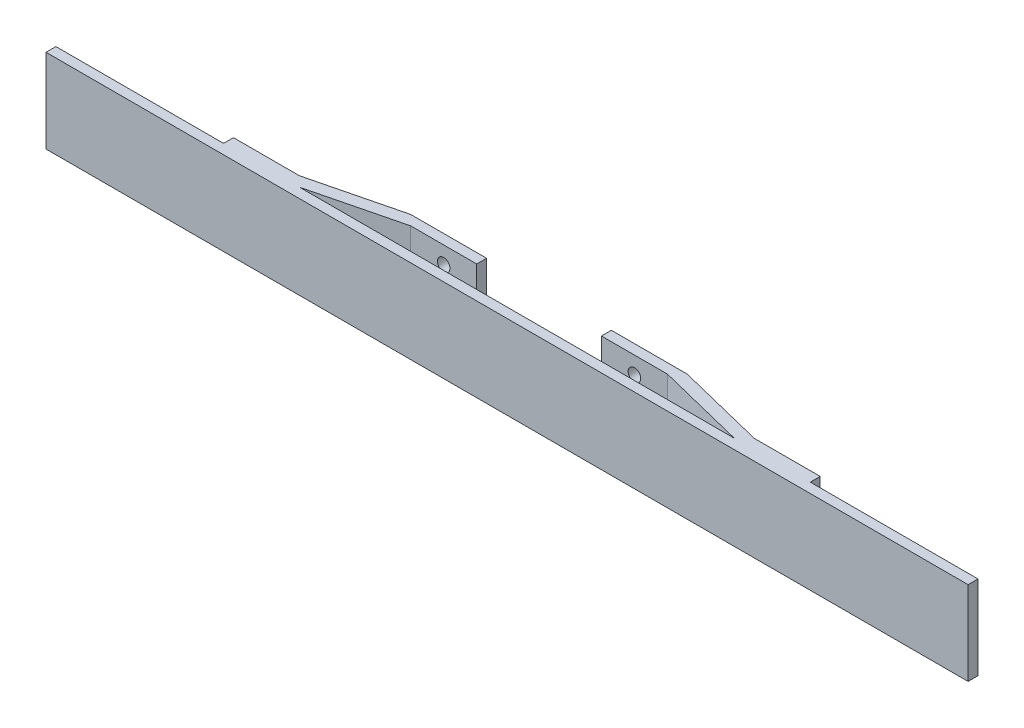
ISO-10303-21;
HEADER;
FILE_DESCRIPTION(('STEP AP214'),'2;1');
FILE_NAME('part.step','',(''),(''),'','','');
FILE_SCHEMA(('AUTOMOTIVE_DESIGN { 1 0 10303 214 1 1 1 1 }'));
ENDSEC;
DATA;
#1=APPLICATION_CONTEXT('core data for automotive mechanical design processes');
#2=APPLICATION_PROTOCOL_DEFINITION('international standard','automotive_design',2000,#1);
#3=PRODUCT_CONTEXT('',#1,'mechanical');
#4=PRODUCT('Part','Part','',(#3));
#5=PRODUCT_RELATED_PRODUCT_CATEGORY('part','',(#4));
#6=PRODUCT_DEFINITION_FORMATION('','',#4);
#7=PRODUCT_DEFINITION_CONTEXT('part definition',#1,'design');
#8=PRODUCT_DEFINITION('design','',#6,#7);
#9=PRODUCT_DEFINITION_SHAPE('','',#8);
#10=(LENGTH_UNIT() NAMED_UNIT(*) SI_UNIT(.MILLI.,.METRE.));
#11=(NAMED_UNIT(*) PLANE_ANGLE_UNIT() SI_UNIT($,.RADIAN.));
#12=(NAMED_UNIT(*) SI_UNIT($,.STERADIAN.) SOLID_ANGLE_UNIT());
#13=UNCERTAINTY_MEASURE_WITH_UNIT(LENGTH_MEASURE(1.E-05),#10,'distance_accuracy_value','');
#14=(GEOMETRIC_REPRESENTATION_CONTEXT(3) GLOBAL_UNCERTAINTY_ASSIGNED_CONTEXT((#13)) GLOBAL_UNIT_ASSIGNED_CONTEXT((#10,
#11,#12)) REPRESENTATION_CONTEXT('',''));
#15=CARTESIAN_POINT('',(0.,0.,0.));
#16=DIRECTION('',(0.,0.,1.));
#17=DIRECTION('',(1.,0.,0.));
#18=AXIS2_PLACEMENT_3D('',#15,#16,#17);
#19=CARTESIAN_POINT('',(-13.3330218068536,-14.8364485981308,9.7));
#20=DIRECTION('',(0.,0.,1.));
#21=DIRECTION('',(1.,0.,0.));
#22=AXIS2_PLACEMENT_3D('',#19,#20,#21);
#23=PLANE('',#22);
#24=DIRECTION('',(0.,1.,0.));
#25=VECTOR('',#24,1.);
#26=CARTESIAN_POINT('',(37.4669781931464,10.5635514018692,9.7));
#27=LINE('',#26,#25);
#28=CARTESIAN_POINT('',(37.4669781931464,-14.8364485981308,9.7));
#29=VERTEX_POINT('',#28);
#30=CARTESIAN_POINT('',(37.4669781931464,10.5635514018692,9.7));
#31=VERTEX_POINT('',#30);
#32=EDGE_CURVE('E239',#29,#31,#27,.T.);
#33=ORIENTED_EDGE('',*,*,#32,.F.);
#34=DIRECTION('',(1.,0.,0.));
#35=VECTOR('',#34,1.);
#36=CARTESIAN_POINT('',(-13.3330218068536,-14.8364485981308,9.7));
#37=LINE('',#36,#35);
#38=CARTESIAN_POINT('',(-13.3330218068536,-14.8364485981308,9.7));
#39=VERTEX_POINT('',#38);
#40=EDGE_CURVE('E198',#39,#29,#37,.T.);
#41=ORIENTED_EDGE('',*,*,#40,.F.);
#42=DIRECTION('',(0.,1.,0.));
#43=VECTOR('',#42,1.);
#44=CARTESIAN_POINT('',(-13.3330218068536,-14.8364485981308,9.7));
#45=LINE('',#44,#43);
#46=CARTESIAN_POINT('',(-13.3330218068536,10.5635514018692,9.7));
#47=VERTEX_POINT('',#46);
#48=EDGE_CURVE('E196',#39,#47,#45,.T.);
#49=ORIENTED_EDGE('',*,*,#48,.T.);
#50=DIRECTION('',(1.,0.,0.));
#51=VECTOR('',#50,1.);
#52=CARTESIAN_POINT('',(-13.3330218068536,10.5635514018692,9.7));
#53=LINE('',#52,#51);
#54=EDGE_CURVE('E186',#47,#31,#53,.T.);
#55=ORIENTED_EDGE('',*,*,#54,.T.);
#56=EDGE_LOOP('',(#33,#41,#49,#55));
#57=FACE_BOUND('',#56,.T.);
#58=ADVANCED_FACE('F34',(#57),#23,.F.);
#59=CARTESIAN_POINT('',(60.4669781931464,-14.8364485981308,9.7));
#60=VERTEX_POINT('',#59);
#61=CARTESIAN_POINT('',(192.266978193146,-14.8364485981308,9.7));
#62=VERTEX_POINT('',#61);
#63=EDGE_CURVE('E206',#60,#62,#37,.T.);
#64=ORIENTED_EDGE('',*,*,#63,.F.);
#65=DIRECTION('',(0.,1.,0.));
#66=VECTOR('',#65,1.);
#67=CARTESIAN_POINT('',(60.4669781931464,-14.8364485981308,9.7));
#68=LINE('',#67,#66);
#69=CARTESIAN_POINT('',(60.4669781931464,10.5635514018692,9.7));
#70=VERTEX_POINT('',#69);
#71=EDGE_CURVE('E281',#60,#70,#68,.T.);
#72=ORIENTED_EDGE('',*,*,#71,.T.);
#73=CARTESIAN_POINT('',(192.266978193146,10.5635514018692,9.7));
#74=VERTEX_POINT('',#73);
#75=EDGE_CURVE('E202',#70,#74,#53,.T.);
#76=ORIENTED_EDGE('',*,*,#75,.T.);
#77=DIRECTION('',(0.,1.,0.));
#78=VECTOR('',#77,1.);
#79=CARTESIAN_POINT('',(192.266978193146,-14.8364485981308,9.7));
#80=LINE('',#79,#78);
#81=EDGE_CURVE('E249',#62,#74,#80,.T.);
#82=ORIENTED_EDGE('',*,*,#81,.F.);
#83=EDGE_LOOP('',(#64,#72,#76,#82));
#84=FACE_BOUND('',#83,.T.);
#85=ADVANCED_FACE('F398',(#84),#23,.F.);
#86=DIRECTION('',(0.,-1.,0.));
#87=VECTOR('',#86,1.);
#88=CARTESIAN_POINT('',(215.266978193146,10.5635514018692,9.7));
#89=LINE('',#88,#87);
#90=CARTESIAN_POINT('',(215.266978193146,10.5635514018692,9.7));
#91=VERTEX_POINT('',#90);
#92=CARTESIAN_POINT('',(215.266978193146,-14.8364485981308,9.7));
#93=VERTEX_POINT('',#92);
#94=EDGE_CURVE('E218',#91,#93,#89,.T.);
#95=ORIENTED_EDGE('',*,*,#94,.F.);
#96=CARTESIAN_POINT('',(266.066978193146,10.5635514018692,9.69999999999999));
#97=VERTEX_POINT('',#96);
#98=EDGE_CURVE('E203',#91,#97,#53,.T.);
#99=ORIENTED_EDGE('',*,*,#98,.T.);
#100=DIRECTION('',(0.,1.,0.));
#101=VECTOR('',#100,1.);
#102=CARTESIAN_POINT('',(266.066978193146,-14.8364485981308,9.69999999999999));
#103=LINE('',#102,#101);
#104=CARTESIAN_POINT('',(266.066978193146,-14.8364485981308,9.69999999999999));
#105=VERTEX_POINT('',#104);
#106=EDGE_CURVE('E193',#105,#97,#103,.T.);
#107=ORIENTED_EDGE('',*,*,#106,.F.);
#108=EDGE_CURVE('E201',#93,#105,#37,.T.);
#109=ORIENTED_EDGE('',*,*,#108,.F.);
#110=EDGE_LOOP('',(#95,#99,#107,#109));
#111=FACE_BOUND('',#110,.T.);
#112=ADVANCED_FACE('F395',(#111),#23,.F.);
#113=CARTESIAN_POINT('',(-26.0330218068536,-14.8364485981308,12.7));
#114=DIRECTION('',(0.,1.,0.));
#115=DIRECTION('',(-1.,0.,0.));
#116=AXIS2_PLACEMENT_3D('',#113,#114,#115);
#117=PLANE('',#116);
#118=DIRECTION('',(1.,0.,0.));
#119=VECTOR('',#118,1.);
#120=CARTESIAN_POINT('',(-26.0330218068536,-14.8364485981308,12.7));
#121=LINE('',#120,#119);
#122=CARTESIAN_POINT('',(-13.3330218068536,-14.8364485981308,12.7));
#123=VERTEX_POINT('',#122);
#124=CARTESIAN_POINT('',(266.066978193146,-14.8364485981308,12.7));
#125=VERTEX_POINT('',#124);
#126=EDGE_CURVE('E191',#123,#125,#121,.T.);
#127=ORIENTED_EDGE('',*,*,#126,.F.);
#128=DIRECTION('',(0.,0.,1.));
#129=VECTOR('',#128,1.);
#130=CARTESIAN_POINT('',(-13.3330218068536,-14.8364485981308,0.));
#131=LINE('',#130,#129);
#132=EDGE_CURVE('E174',#39,#123,#131,.T.);
#133=ORIENTED_EDGE('',*,*,#132,.F.);
#134=ORIENTED_EDGE('',*,*,#40,.T.);
#135=DIRECTION('',(0.,0.,1.));
#136=VECTOR('',#135,1.);
#137=CARTESIAN_POINT('',(37.4669781931464,-14.8364485981308,0.));
#138=LINE('',#137,#136);
#139=CARTESIAN_POINT('',(37.4669781931464,-14.8364485981308,6.7));
#140=VERTEX_POINT('',#139);
#141=EDGE_CURVE('E236',#140,#29,#138,.T.);
#142=ORIENTED_EDGE('',*,*,#141,.F.);
#143=DIRECTION('',(1.,0.,0.));
#144=VECTOR('',#143,1.);
#145=CARTESIAN_POINT('',(37.4669781931464,-14.8364485981308,6.7));
#146=LINE('',#145,#144);
#147=CARTESIAN_POINT('',(57.4669781931464,-14.8364485981308,6.7));
#148=VERTEX_POINT('',#147);
#149=EDGE_CURVE('E310',#140,#148,#146,.T.);
#150=ORIENTED_EDGE('',*,*,#149,.T.);
#151=DIRECTION('',(0.970563929002576,0.,-0.24084364164138));
#152=VECTOR('',#151,1.);
#153=CARTESIAN_POINT('',(57.4669781931464,-14.8364485981308,6.7));
#154=LINE('',#153,#152);
#155=CARTESIAN_POINT('',(84.4669781931464,-14.8364485981308,0.));
#156=VERTEX_POINT('',#155);
#157=EDGE_CURVE('E306',#148,#156,#154,.T.);
#158=ORIENTED_EDGE('',*,*,#157,.T.);
#159=DIRECTION('',(-1.,0.,0.));
#160=VECTOR('',#159,1.);
#161=CARTESIAN_POINT('',(37.4669781931464,-14.8364485981308,0.));
#162=LINE('',#161,#160);
#163=CARTESIAN_POINT('',(107.466978193146,-14.8364485981308,0.));
#164=VERTEX_POINT('',#163);
#165=EDGE_CURVE('E238',#164,#156,#162,.T.);
#166=ORIENTED_EDGE('',*,*,#165,.F.);
#167=DIRECTION('',(0.,0.,1.));
#168=VECTOR('',#167,1.);
#169=CARTESIAN_POINT('',(107.466978193146,-14.8364485981308,0.));
#170=LINE('',#169,#168);
#171=CARTESIAN_POINT('',(107.466978193146,-14.8364485981308,3.));
#172=VERTEX_POINT('',#171);
#173=EDGE_CURVE('E233',#164,#172,#170,.T.);
#174=ORIENTED_EDGE('',*,*,#173,.T.);
#175=DIRECTION('',(-1.,0.,0.));
#176=VECTOR('',#175,1.);
#177=CARTESIAN_POINT('',(107.466978193146,-14.8364485981308,3.));
#178=LINE('',#177,#176);
#179=CARTESIAN_POINT('',(87.4669781931464,-14.8364485981308,3.));
#180=VERTEX_POINT('',#179);
#181=EDGE_CURVE('E49',#172,#180,#178,.T.);
#182=ORIENTED_EDGE('',*,*,#181,.T.);
#183=DIRECTION('',(-0.970563929002577,0.,0.24084364164138));
#184=VECTOR('',#183,1.);
#185=CARTESIAN_POINT('',(87.4669781931464,-14.8364485981308,3.));
#186=LINE('',#185,#184);
#187=EDGE_CURVE('E289',#180,#60,#186,.T.);
#188=ORIENTED_EDGE('',*,*,#187,.T.);
#189=ORIENTED_EDGE('',*,*,#63,.T.);
#190=DIRECTION('',(-0.970563929002576,0.,-0.24084364164138));
#191=VECTOR('',#190,1.);
#192=CARTESIAN_POINT('',(192.266978193146,-14.8364485981308,9.7));
#193=LINE('',#192,#191);
#194=CARTESIAN_POINT('',(165.266978193146,-14.8364485981308,3.));
#195=VERTEX_POINT('',#194);
#196=EDGE_CURVE('E259',#62,#195,#193,.T.);
#197=ORIENTED_EDGE('',*,*,#196,.T.);
#198=DIRECTION('',(-1.,0.,0.));
#199=VECTOR('',#198,1.);
#200=CARTESIAN_POINT('',(165.266978193146,-14.8364485981308,3.));
#201=LINE('',#200,#199);
#202=CARTESIAN_POINT('',(145.266978193146,-14.8364485981308,3.));
#203=VERTEX_POINT('',#202);
#204=EDGE_CURVE('E253',#195,#203,#201,.T.);
#205=ORIENTED_EDGE('',*,*,#204,.T.);
#206=DIRECTION('',(0.,0.,1.));
#207=VECTOR('',#206,1.);
#208=CARTESIAN_POINT('',(145.266978193146,-14.8364485981308,0.));
#209=LINE('',#208,#207);
#210=CARTESIAN_POINT('',(145.266978193146,-14.8364485981308,0.));
#211=VERTEX_POINT('',#210);
#212=EDGE_CURVE('E214',#211,#203,#209,.T.);
#213=ORIENTED_EDGE('',*,*,#212,.F.);
#214=DIRECTION('',(-1.,0.,0.));
#215=VECTOR('',#214,1.);
#216=CARTESIAN_POINT('',(145.266978193146,-14.8364485981308,0.));
#217=LINE('',#216,#215);
#218=CARTESIAN_POINT('',(168.266978193146,-14.8364485981308,0.));
#219=VERTEX_POINT('',#218);
#220=EDGE_CURVE('E217',#219,#211,#217,.T.);
#221=ORIENTED_EDGE('',*,*,#220,.F.);
#222=DIRECTION('',(0.970563929002576,0.,0.24084364164138));
#223=VECTOR('',#222,1.);
#224=CARTESIAN_POINT('',(195.266978193146,-14.8364485981308,6.7));
#225=LINE('',#224,#223);
#226=CARTESIAN_POINT('',(195.266978193146,-14.8364485981308,6.7));
#227=VERTEX_POINT('',#226);
#228=EDGE_CURVE('E277',#219,#227,#225,.T.);
#229=ORIENTED_EDGE('',*,*,#228,.T.);
#230=DIRECTION('',(1.,0.,0.));
#231=VECTOR('',#230,1.);
#232=CARTESIAN_POINT('',(215.266978193146,-14.8364485981308,6.69999999999999));
#233=LINE('',#232,#231);
#234=CARTESIAN_POINT('',(215.266978193146,-14.8364485981308,6.69999999999999));
#235=VERTEX_POINT('',#234);
#236=EDGE_CURVE('E271',#227,#235,#233,.T.);
#237=ORIENTED_EDGE('',*,*,#236,.T.);
#238=DIRECTION('',(0.,0.,1.));
#239=VECTOR('',#238,1.);
#240=CARTESIAN_POINT('',(215.266978193146,-14.8364485981308,0.));
#241=LINE('',#240,#239);
#242=EDGE_CURVE('E212',#235,#93,#241,.T.);
#243=ORIENTED_EDGE('',*,*,#242,.T.);
#244=ORIENTED_EDGE('',*,*,#108,.T.);
#245=DIRECTION('',(0.,0.,1.));
#246=VECTOR('',#245,1.);
#247=CARTESIAN_POINT('',(266.066978193146,-14.8364485981308,0.));
#248=LINE('',#247,#246);
#249=EDGE_CURVE('E318',#105,#125,#248,.T.);
#250=ORIENTED_EDGE('',*,*,#249,.T.);
#251=EDGE_LOOP('',(#127,#133,#134,#142,#150,#158,#166,#174,#182,#188,#189,#197,#205,#213,#221,
#229,#237,#243,#244,#250));
#252=FACE_BOUND('',#251,.T.);
#253=ADVANCED_FACE('F36',(#252),#117,.F.);
#254=CARTESIAN_POINT('',(-26.0330218068536,10.5635514018692,12.7));
#255=DIRECTION('',(0.,1.,0.));
#256=DIRECTION('',(0.,0.,1.));
#257=AXIS2_PLACEMENT_3D('',#254,#255,#256);
#258=PLANE('',#257);
#259=DIRECTION('',(0.,0.,1.));
#260=VECTOR('',#259,1.);
#261=CARTESIAN_POINT('',(-13.3330218068536,10.5635514018692,0.));
#262=LINE('',#261,#260);
#263=CARTESIAN_POINT('',(-13.3330218068536,10.5635514018692,12.7));
#264=VERTEX_POINT('',#263);
#265=EDGE_CURVE('E171',#47,#264,#262,.T.);
#266=ORIENTED_EDGE('',*,*,#265,.T.);
#267=DIRECTION('',(1.,0.,0.));
#268=VECTOR('',#267,1.);
#269=CARTESIAN_POINT('',(-26.0330218068536,10.5635514018692,12.7));
#270=LINE('',#269,#268);
#271=CARTESIAN_POINT('',(266.066978193146,10.5635514018692,12.7));
#272=VERTEX_POINT('',#271);
#273=EDGE_CURVE('E184',#264,#272,#270,.T.);
#274=ORIENTED_EDGE('',*,*,#273,.T.);
#275=DIRECTION('',(0.,0.,1.));
#276=VECTOR('',#275,1.);
#277=CARTESIAN_POINT('',(266.066978193146,10.5635514018692,0.));
#278=LINE('',#277,#276);
#279=EDGE_CURVE('E187',#97,#272,#278,.T.);
#280=ORIENTED_EDGE('',*,*,#279,.F.);
#281=ORIENTED_EDGE('',*,*,#98,.F.);
#282=DIRECTION('',(0.,0.,1.));
#283=VECTOR('',#282,1.);
#284=CARTESIAN_POINT('',(215.266978193146,10.5635514018692,0.));
#285=LINE('',#284,#283);
#286=CARTESIAN_POINT('',(215.266978193146,10.5635514018692,6.69999999999999));
#287=VERTEX_POINT('',#286);
#288=EDGE_CURVE('E210',#287,#91,#285,.T.);
#289=ORIENTED_EDGE('',*,*,#288,.F.);
#290=DIRECTION('',(1.,0.,0.));
#291=VECTOR('',#290,1.);
#292=CARTESIAN_POINT('',(215.266978193146,10.5635514018692,6.69999999999999));
#293=LINE('',#292,#291);
#294=CARTESIAN_POINT('',(195.266978193146,10.5635514018692,6.7));
#295=VERTEX_POINT('',#294);
#296=EDGE_CURVE('E275',#295,#287,#293,.T.);
#297=ORIENTED_EDGE('',*,*,#296,.F.);
#298=DIRECTION('',(0.970563929002576,0.,0.24084364164138));
#299=VECTOR('',#298,1.);
#300=CARTESIAN_POINT('',(195.266978193146,10.5635514018692,6.7));
#301=LINE('',#300,#299);
#302=CARTESIAN_POINT('',(168.266978193146,10.5635514018692,0.));
#303=VERTEX_POINT('',#302);
#304=EDGE_CURVE('E278',#303,#295,#301,.T.);
#305=ORIENTED_EDGE('',*,*,#304,.F.);
#306=DIRECTION('',(1.,0.,0.));
#307=VECTOR('',#306,1.);
#308=CARTESIAN_POINT('',(145.266978193146,10.5635514018692,0.));
#309=LINE('',#308,#307);
#310=CARTESIAN_POINT('',(145.266978193146,10.5635514018692,0.));
#311=VERTEX_POINT('',#310);
#312=EDGE_CURVE('E224',#311,#303,#309,.T.);
#313=ORIENTED_EDGE('',*,*,#312,.F.);
#314=DIRECTION('',(0.,0.,1.));
#315=VECTOR('',#314,1.);
#316=CARTESIAN_POINT('',(145.266978193146,10.5635514018692,0.));
#317=LINE('',#316,#315);
#318=CARTESIAN_POINT('',(145.266978193146,10.5635514018692,3.));
#319=VERTEX_POINT('',#318);
#320=EDGE_CURVE('E207',#311,#319,#317,.T.);
#321=ORIENTED_EDGE('',*,*,#320,.T.);
#322=DIRECTION('',(-1.,0.,0.));
#323=VECTOR('',#322,1.);
#324=CARTESIAN_POINT('',(165.266978193146,10.5635514018692,3.));
#325=LINE('',#324,#323);
#326=CARTESIAN_POINT('',(165.266978193146,10.5635514018692,3.));
#327=VERTEX_POINT('',#326);
#328=EDGE_CURVE('E257',#327,#319,#325,.T.);
#329=ORIENTED_EDGE('',*,*,#328,.F.);
#330=DIRECTION('',(-0.970563929002576,0.,-0.24084364164138));
#331=VECTOR('',#330,1.);
#332=CARTESIAN_POINT('',(192.266978193146,10.5635514018692,9.7));
#333=LINE('',#332,#331);
#334=EDGE_CURVE('E260',#74,#327,#333,.T.);
#335=ORIENTED_EDGE('',*,*,#334,.F.);
#336=ORIENTED_EDGE('',*,*,#75,.F.);
#337=DIRECTION('',(-0.970563929002577,0.,0.24084364164138));
#338=VECTOR('',#337,1.);
#339=CARTESIAN_POINT('',(87.4669781931464,10.5635514018692,3.));
#340=LINE('',#339,#338);
#341=CARTESIAN_POINT('',(87.4669781931464,10.5635514018692,3.));
#342=VERTEX_POINT('',#341);
#343=EDGE_CURVE('E293',#342,#70,#340,.T.);
#344=ORIENTED_EDGE('',*,*,#343,.F.);
#345=DIRECTION('',(-1.,0.,0.));
#346=VECTOR('',#345,1.);
#347=CARTESIAN_POINT('',(107.466978193146,10.5635514018692,3.));
#348=LINE('',#347,#346);
#349=CARTESIAN_POINT('',(107.466978193146,10.5635514018692,3.));
#350=VERTEX_POINT('',#349);
#351=EDGE_CURVE('E296',#350,#342,#348,.T.);
#352=ORIENTED_EDGE('',*,*,#351,.F.);
#353=DIRECTION('',(0.,0.,1.));
#354=VECTOR('',#353,1.);
#355=CARTESIAN_POINT('',(107.466978193146,10.5635514018692,0.));
#356=LINE('',#355,#354);
#357=CARTESIAN_POINT('',(107.466978193146,10.5635514018692,0.));
#358=VERTEX_POINT('',#357);
#359=EDGE_CURVE('E230',#358,#350,#356,.T.);
#360=ORIENTED_EDGE('',*,*,#359,.F.);
#361=DIRECTION('',(1.,0.,0.));
#362=VECTOR('',#361,1.);
#363=CARTESIAN_POINT('',(37.4669781931464,10.5635514018692,0.));
#364=LINE('',#363,#362);
#365=CARTESIAN_POINT('',(84.4669781931464,10.5635514018692,0.));
#366=VERTEX_POINT('',#365);
#367=EDGE_CURVE('E242',#366,#358,#364,.T.);
#368=ORIENTED_EDGE('',*,*,#367,.F.);
#369=DIRECTION('',(0.970563929002576,0.,-0.24084364164138));
#370=VECTOR('',#369,1.);
#371=CARTESIAN_POINT('',(57.4669781931464,10.5635514018692,6.7));
#372=LINE('',#371,#370);
#373=CARTESIAN_POINT('',(57.4669781931464,10.5635514018692,6.7));
#374=VERTEX_POINT('',#373);
#375=EDGE_CURVE('E57',#374,#366,#372,.T.);
#376=ORIENTED_EDGE('',*,*,#375,.F.);
#377=DIRECTION('',(1.,0.,0.));
#378=VECTOR('',#377,1.);
#379=CARTESIAN_POINT('',(37.4669781931464,10.5635514018692,6.7));
#380=LINE('',#379,#378);
#381=CARTESIAN_POINT('',(37.4669781931464,10.5635514018692,6.7));
#382=VERTEX_POINT('',#381);
#383=EDGE_CURVE('E311',#382,#374,#380,.T.);
#384=ORIENTED_EDGE('',*,*,#383,.F.);
#385=DIRECTION('',(0.,0.,1.));
#386=VECTOR('',#385,1.);
#387=CARTESIAN_POINT('',(37.4669781931464,10.5635514018692,0.));
#388=LINE('',#387,#386);
#389=EDGE_CURVE('E222',#382,#31,#388,.T.);
#390=ORIENTED_EDGE('',*,*,#389,.T.);
#391=ORIENTED_EDGE('',*,*,#54,.F.);
#392=EDGE_LOOP('',(#266,#274,#280,#281,#289,#297,#305,#313,#321,#329,#335,#336,#344,#352,#360,
#368,#376,#384,#390,#391));
#393=FACE_BOUND('',#392,.T.);
#394=ADVANCED_FACE('F182',(#393),#258,.T.);
#395=CARTESIAN_POINT('',(0.,0.,12.7));
#396=DIRECTION('',(0.,0.,1.));
#397=DIRECTION('',(1.,0.,0.));
#398=AXIS2_PLACEMENT_3D('',#395,#396,#397);
#399=PLANE('',#398);
#400=ORIENTED_EDGE('',*,*,#273,.F.);
#401=DIRECTION('',(0.,-1.,0.));
#402=VECTOR('',#401,1.);
#403=CARTESIAN_POINT('',(-13.3330218068536,-14.8364485981308,12.7));
#404=LINE('',#403,#402);
#405=EDGE_CURVE('E11',#264,#123,#404,.T.);
#406=ORIENTED_EDGE('',*,*,#405,.T.);
#407=ORIENTED_EDGE('',*,*,#126,.T.);
#408=DIRECTION('',(0.,-1.,0.));
#409=VECTOR('',#408,1.);
#410=CARTESIAN_POINT('',(266.066978193146,0.,12.7));
#411=LINE('',#410,#409);
#412=EDGE_CURVE('E42',#125,#272,#411,.F.);
#413=ORIENTED_EDGE('',*,*,#412,.T.);
#414=EDGE_LOOP('',(#400,#406,#407,#413));
#415=FACE_BOUND('',#414,.T.);
#416=ADVANCED_FACE('F190',(#415),#399,.T.);
#417=CARTESIAN_POINT('',(145.266978193146,10.5635514018692,0.));
#418=DIRECTION('',(1.,0.,0.));
#419=DIRECTION('',(0.,0.,-1.));
#420=AXIS2_PLACEMENT_3D('',#417,#418,#419);
#421=PLANE('',#420);
#422=ORIENTED_EDGE('',*,*,#212,.T.);
#423=DIRECTION('',(0.,1.,0.));
#424=VECTOR('',#423,1.);
#425=CARTESIAN_POINT('',(145.266978193146,-14.8364485981308,3.));
#426=LINE('',#425,#424);
#427=EDGE_CURVE('E243',#203,#319,#426,.T.);
#428=ORIENTED_EDGE('',*,*,#427,.T.);
#429=ORIENTED_EDGE('',*,*,#320,.F.);
#430=DIRECTION('',(0.,1.,0.));
#431=VECTOR('',#430,1.);
#432=CARTESIAN_POINT('',(145.266978193146,10.5635514018692,0.));
#433=LINE('',#432,#431);
#434=EDGE_CURVE('E221',#211,#311,#433,.T.);
#435=ORIENTED_EDGE('',*,*,#434,.F.);
#436=EDGE_LOOP('',(#422,#428,#429,#435));
#437=FACE_BOUND('',#436,.T.);
#438=ADVANCED_FACE('F408',(#437),#421,.F.);
#439=CARTESIAN_POINT('',(215.266978193146,10.5635514018692,0.));
#440=DIRECTION('',(-1.,0.,0.));
#441=DIRECTION('',(0.,0.,1.));
#442=AXIS2_PLACEMENT_3D('',#439,#440,#441);
#443=PLANE('',#442);
#444=ORIENTED_EDGE('',*,*,#242,.F.);
#445=DIRECTION('',(0.,1.,0.));
#446=VECTOR('',#445,1.);
#447=CARTESIAN_POINT('',(215.266978193146,-14.8364485981308,6.69999999999999));
#448=LINE('',#447,#446);
#449=EDGE_CURVE('E263',#235,#287,#448,.T.);
#450=ORIENTED_EDGE('',*,*,#449,.T.);
#451=ORIENTED_EDGE('',*,*,#288,.T.);
#452=ORIENTED_EDGE('',*,*,#94,.T.);
#453=EDGE_LOOP('',(#444,#450,#451,#452));
#454=FACE_BOUND('',#453,.T.);
#455=ADVANCED_FACE('F424',(#454),#443,.F.);
#456=CARTESIAN_POINT('',(0.,0.,0.));
#457=DIRECTION('',(0.,0.,1.));
#458=DIRECTION('',(1.,0.,0.));
#459=AXIS2_PLACEMENT_3D('',#456,#457,#458);
#460=PLANE('',#459);
#461=CARTESIAN_POINT('',(155.266978193146,-9.63644859813084,0.));
#462=DIRECTION('',(0.,0.,1.));
#463=DIRECTION('',(1.,0.,0.));
#464=AXIS2_PLACEMENT_3D('',#461,#462,#463);
#465=CIRCLE('',#464,1.89864999999999);
#466=CARTESIAN_POINT('',(157.165628193146,-9.63644859813084,0.));
#467=VERTEX_POINT('',#466);
#468=EDGE_CURVE('E329',#467,#467,#465,.T.);
#469=ORIENTED_EDGE('',*,*,#468,.T.);
#470=EDGE_LOOP('',(#469));
#471=FACE_BOUND('',#470,.T.);
#472=CARTESIAN_POINT('',(155.266978193146,5.36355140186916,0.));
#473=DIRECTION('',(0.,0.,1.));
#474=DIRECTION('',(1.,0.,0.));
#475=AXIS2_PLACEMENT_3D('',#472,#473,#474);
#476=CIRCLE('',#475,1.89864999999999);
#477=CARTESIAN_POINT('',(157.165628193146,5.36355140186916,0.));
#478=VERTEX_POINT('',#477);
#479=EDGE_CURVE('E321',#478,#478,#476,.T.);
#480=ORIENTED_EDGE('',*,*,#479,.T.);
#481=EDGE_LOOP('',(#480));
#482=FACE_BOUND('',#481,.T.);
#483=ORIENTED_EDGE('',*,*,#312,.T.);
#484=DIRECTION('',(0.,1.,0.));
#485=VECTOR('',#484,1.);
#486=CARTESIAN_POINT('',(168.266978193146,-14.8364485981308,0.));
#487=LINE('',#486,#485);
#488=EDGE_CURVE('E268',#219,#303,#487,.T.);
#489=ORIENTED_EDGE('',*,*,#488,.F.);
#490=ORIENTED_EDGE('',*,*,#220,.T.);
#491=ORIENTED_EDGE('',*,*,#434,.T.);
#492=EDGE_LOOP('',(#483,#489,#490,#491));
#493=FACE_BOUND('',#492,.T.);
#494=ADVANCED_FACE('F414',(#471,#482,#493),#460,.F.);
#495=CARTESIAN_POINT('',(37.4669781931464,10.5635514018692,0.));
#496=DIRECTION('',(1.,0.,0.));
#497=DIRECTION('',(0.,0.,-1.));
#498=AXIS2_PLACEMENT_3D('',#495,#496,#497);
#499=PLANE('',#498);
#500=ORIENTED_EDGE('',*,*,#389,.F.);
#501=DIRECTION('',(0.,1.,0.));
#502=VECTOR('',#501,1.);
#503=CARTESIAN_POINT('',(37.4669781931464,-14.8364485981308,6.7));
#504=LINE('',#503,#502);
#505=EDGE_CURVE('E303',#140,#382,#504,.T.);
#506=ORIENTED_EDGE('',*,*,#505,.F.);
#507=ORIENTED_EDGE('',*,*,#141,.T.);
#508=ORIENTED_EDGE('',*,*,#32,.T.);
#509=EDGE_LOOP('',(#500,#506,#507,#508));
#510=FACE_BOUND('',#509,.T.);
#511=ADVANCED_FACE('F381',(#510),#499,.F.);
#512=CARTESIAN_POINT('',(107.466978193146,10.5635514018692,0.));
#513=DIRECTION('',(-1.,0.,0.));
#514=DIRECTION('',(0.,0.,1.));
#515=AXIS2_PLACEMENT_3D('',#512,#513,#514);
#516=PLANE('',#515);
#517=ORIENTED_EDGE('',*,*,#359,.T.);
#518=DIRECTION('',(0.,1.,0.));
#519=VECTOR('',#518,1.);
#520=CARTESIAN_POINT('',(107.466978193146,-14.8364485981308,3.));
#521=LINE('',#520,#519);
#522=EDGE_CURVE('E286',#172,#350,#521,.T.);
#523=ORIENTED_EDGE('',*,*,#522,.F.);
#524=ORIENTED_EDGE('',*,*,#173,.F.);
#525=DIRECTION('',(0.,-1.,0.));
#526=VECTOR('',#525,1.);
#527=CARTESIAN_POINT('',(107.466978193146,10.5635514018692,0.));
#528=LINE('',#527,#526);
#529=EDGE_CURVE('E246',#358,#164,#528,.T.);
#530=ORIENTED_EDGE('',*,*,#529,.F.);
#531=EDGE_LOOP('',(#517,#523,#524,#530));
#532=FACE_BOUND('',#531,.T.);
#533=ADVANCED_FACE('F368',(#532),#516,.F.);
#534=CARTESIAN_POINT('',(0.,0.,0.));
#535=DIRECTION('',(0.,0.,1.));
#536=DIRECTION('',(1.,0.,0.));
#537=AXIS2_PLACEMENT_3D('',#534,#535,#536);
#538=PLANE('',#537);
#539=CARTESIAN_POINT('',(97.4669781931464,5.36355140186916,0.));
#540=DIRECTION('',(0.,0.,1.));
#541=DIRECTION('',(1.,0.,0.));
#542=AXIS2_PLACEMENT_3D('',#539,#540,#541);
#543=CIRCLE('',#542,1.89864999999999);
#544=CARTESIAN_POINT('',(99.3656281931464,5.36355140186916,0.));
#545=VERTEX_POINT('',#544);
#546=EDGE_CURVE('E341',#545,#545,#543,.T.);
#547=ORIENTED_EDGE('',*,*,#546,.T.);
#548=EDGE_LOOP('',(#547));
#549=FACE_BOUND('',#548,.T.);
#550=CARTESIAN_POINT('',(97.4669781931464,-9.63644859813084,0.));
#551=DIRECTION('',(0.,0.,1.));
#552=DIRECTION('',(1.,0.,0.));
#553=AXIS2_PLACEMENT_3D('',#550,#551,#552);
#554=CIRCLE('',#553,1.89864999999999);
#555=CARTESIAN_POINT('',(99.3656281931464,-9.63644859813084,0.));
#556=VERTEX_POINT('',#555);
#557=EDGE_CURVE('E335',#556,#556,#554,.T.);
#558=ORIENTED_EDGE('',*,*,#557,.T.);
#559=EDGE_LOOP('',(#558));
#560=FACE_BOUND('',#559,.T.);
#561=ORIENTED_EDGE('',*,*,#165,.T.);
#562=DIRECTION('',(0.,1.,0.));
#563=VECTOR('',#562,1.);
#564=CARTESIAN_POINT('',(84.4669781931464,-14.8364485981308,0.));
#565=LINE('',#564,#563);
#566=EDGE_CURVE('E299',#156,#366,#565,.T.);
#567=ORIENTED_EDGE('',*,*,#566,.T.);
#568=ORIENTED_EDGE('',*,*,#367,.T.);
#569=ORIENTED_EDGE('',*,*,#529,.T.);
#570=EDGE_LOOP('',(#561,#567,#568,#569));
#571=FACE_BOUND('',#570,.T.);
#572=ADVANCED_FACE('F372',(#549,#560,#571),#538,.F.);
#573=CARTESIAN_POINT('',(215.266978193146,-14.8364485981308,6.69999999999999));
#574=DIRECTION('',(0.,0.,1.));
#575=DIRECTION('',(1.,0.,0.));
#576=AXIS2_PLACEMENT_3D('',#573,#574,#575);
#577=PLANE('',#576);
#578=ORIENTED_EDGE('',*,*,#296,.T.);
#579=ORIENTED_EDGE('',*,*,#449,.F.);
#580=ORIENTED_EDGE('',*,*,#236,.F.);
#581=DIRECTION('',(0.,1.,0.));
#582=VECTOR('',#581,1.);
#583=CARTESIAN_POINT('',(195.266978193146,-14.8364485981308,6.7));
#584=LINE('',#583,#582);
#585=EDGE_CURVE('E270',#227,#295,#584,.T.);
#586=ORIENTED_EDGE('',*,*,#585,.T.);
#587=EDGE_LOOP('',(#578,#579,#580,#586));
#588=FACE_BOUND('',#587,.T.);
#589=ADVANCED_FACE('F420',(#588),#577,.F.);
#590=CARTESIAN_POINT('',(195.266978193146,-14.8364485981308,6.7));
#591=DIRECTION('',(-0.24084364164138,0.,0.970563929002577));
#592=DIRECTION('',(0.970563929002577,0.,0.24084364164138));
#593=AXIS2_PLACEMENT_3D('',#590,#591,#592);
#594=PLANE('',#593);
#595=ORIENTED_EDGE('',*,*,#304,.T.);
#596=ORIENTED_EDGE('',*,*,#585,.F.);
#597=ORIENTED_EDGE('',*,*,#228,.F.);
#598=ORIENTED_EDGE('',*,*,#488,.T.);
#599=EDGE_LOOP('',(#595,#596,#597,#598));
#600=FACE_BOUND('',#599,.T.);
#601=ADVANCED_FACE('F417',(#600),#594,.F.);
#602=CARTESIAN_POINT('',(165.266978193146,-14.8364485981308,3.));
#603=DIRECTION('',(0.,0.,-1.));
#604=DIRECTION('',(-1.,0.,0.));
#605=AXIS2_PLACEMENT_3D('',#602,#603,#604);
#606=PLANE('',#605);
#607=CARTESIAN_POINT('',(155.266978193146,-9.63644859813084,3.00000000000002));
#608=DIRECTION('',(0.,0.,1.));
#609=DIRECTION('',(1.,0.,0.));
#610=AXIS2_PLACEMENT_3D('',#607,#608,#609);
#611=CIRCLE('',#610,1.89864999999997);
#612=CARTESIAN_POINT('',(157.165628193146,-9.63644859813084,3.00000000000002));
#613=VERTEX_POINT('',#612);
#614=EDGE_CURVE('E332',#613,#613,#611,.T.);
#615=ORIENTED_EDGE('',*,*,#614,.F.);
#616=EDGE_LOOP('',(#615));
#617=FACE_BOUND('',#616,.T.);
#618=CARTESIAN_POINT('',(155.266978193146,5.36355140186916,3.00000000000002));
#619=DIRECTION('',(0.,0.,1.));
#620=DIRECTION('',(1.,0.,0.));
#621=AXIS2_PLACEMENT_3D('',#618,#619,#620);
#622=CIRCLE('',#621,1.89864999999997);
#623=CARTESIAN_POINT('',(157.165628193146,5.36355140186916,3.00000000000002));
#624=VERTEX_POINT('',#623);
#625=EDGE_CURVE('E326',#624,#624,#622,.T.);
#626=ORIENTED_EDGE('',*,*,#625,.F.);
#627=EDGE_LOOP('',(#626));
#628=FACE_BOUND('',#627,.T.);
#629=ORIENTED_EDGE('',*,*,#328,.T.);
#630=ORIENTED_EDGE('',*,*,#427,.F.);
#631=ORIENTED_EDGE('',*,*,#204,.F.);
#632=DIRECTION('',(0.,1.,0.));
#633=VECTOR('',#632,1.);
#634=CARTESIAN_POINT('',(165.266978193146,-14.8364485981308,3.));
#635=LINE('',#634,#633);
#636=EDGE_CURVE('E252',#195,#327,#635,.T.);
#637=ORIENTED_EDGE('',*,*,#636,.T.);
#638=EDGE_LOOP('',(#629,#630,#631,#637));
#639=FACE_BOUND('',#638,.T.);
#640=ADVANCED_FACE('F405',(#617,#628,#639),#606,.F.);
#641=CARTESIAN_POINT('',(192.266978193146,-14.8364485981308,9.7));
#642=DIRECTION('',(0.24084364164138,0.,-0.970563929002577));
#643=DIRECTION('',(-0.970563929002577,0.,-0.24084364164138));
#644=AXIS2_PLACEMENT_3D('',#641,#642,#643);
#645=PLANE('',#644);
#646=ORIENTED_EDGE('',*,*,#334,.T.);
#647=ORIENTED_EDGE('',*,*,#636,.F.);
#648=ORIENTED_EDGE('',*,*,#196,.F.);
#649=ORIENTED_EDGE('',*,*,#81,.T.);
#650=EDGE_LOOP('',(#646,#647,#648,#649));
#651=FACE_BOUND('',#650,.T.);
#652=ADVANCED_FACE('F401',(#651),#645,.F.);
#653=CARTESIAN_POINT('',(57.4669781931464,-14.8364485981308,6.7));
#654=DIRECTION('',(0.24084364164138,0.,0.970563929002577));
#655=DIRECTION('',(0.970563929002577,0.,-0.24084364164138));
#656=AXIS2_PLACEMENT_3D('',#653,#654,#655);
#657=PLANE('',#656);
#658=ORIENTED_EDGE('',*,*,#375,.T.);
#659=ORIENTED_EDGE('',*,*,#566,.F.);
#660=ORIENTED_EDGE('',*,*,#157,.F.);
#661=DIRECTION('',(0.,1.,0.));
#662=VECTOR('',#661,1.);
#663=CARTESIAN_POINT('',(57.4669781931464,-14.8364485981308,6.7));
#664=LINE('',#663,#662);
#665=EDGE_CURVE('E305',#148,#374,#664,.T.);
#666=ORIENTED_EDGE('',*,*,#665,.T.);
#667=EDGE_LOOP('',(#658,#659,#660,#666));
#668=FACE_BOUND('',#667,.T.);
#669=ADVANCED_FACE('F374',(#668),#657,.F.);
#670=CARTESIAN_POINT('',(37.4669781931464,-14.8364485981308,6.7));
#671=DIRECTION('',(0.,0.,1.));
#672=DIRECTION('',(1.,0.,0.));
#673=AXIS2_PLACEMENT_3D('',#670,#671,#672);
#674=PLANE('',#673);
#675=ORIENTED_EDGE('',*,*,#383,.T.);
#676=ORIENTED_EDGE('',*,*,#665,.F.);
#677=ORIENTED_EDGE('',*,*,#149,.F.);
#678=ORIENTED_EDGE('',*,*,#505,.T.);
#679=EDGE_LOOP('',(#675,#676,#677,#678));
#680=FACE_BOUND('',#679,.T.);
#681=ADVANCED_FACE('F378',(#680),#674,.F.);
#682=CARTESIAN_POINT('',(87.4669781931464,-14.8364485981308,3.));
#683=DIRECTION('',(-0.24084364164138,0.,-0.970563929002577));
#684=DIRECTION('',(-0.970563929002577,0.,0.24084364164138));
#685=AXIS2_PLACEMENT_3D('',#682,#683,#684);
#686=PLANE('',#685);
#687=ORIENTED_EDGE('',*,*,#343,.T.);
#688=ORIENTED_EDGE('',*,*,#71,.F.);
#689=ORIENTED_EDGE('',*,*,#187,.F.);
#690=DIRECTION('',(0.,1.,0.));
#691=VECTOR('',#690,1.);
#692=CARTESIAN_POINT('',(87.4669781931464,-14.8364485981308,3.));
#693=LINE('',#692,#691);
#694=EDGE_CURVE('E288',#180,#342,#693,.T.);
#695=ORIENTED_EDGE('',*,*,#694,.T.);
#696=EDGE_LOOP('',(#687,#688,#689,#695));
#697=FACE_BOUND('',#696,.T.);
#698=ADVANCED_FACE('F353',(#697),#686,.F.);
#699=CARTESIAN_POINT('',(107.466978193146,-14.8364485981308,3.));
#700=DIRECTION('',(0.,0.,-1.));
#701=DIRECTION('',(-1.,0.,0.));
#702=AXIS2_PLACEMENT_3D('',#699,#700,#701);
#703=PLANE('',#702);
#704=CARTESIAN_POINT('',(97.4669781931464,5.36355140186916,3.00000000000002));
#705=DIRECTION('',(0.,0.,1.));
#706=DIRECTION('',(1.,0.,0.));
#707=AXIS2_PLACEMENT_3D('',#704,#705,#706);
#708=CIRCLE('',#707,1.89864999999999);
#709=CARTESIAN_POINT('',(99.3656281931464,5.36355140186916,3.00000000000002));
#710=VERTEX_POINT('',#709);
#711=EDGE_CURVE('E344',#710,#710,#708,.T.);
#712=ORIENTED_EDGE('',*,*,#711,.F.);
#713=EDGE_LOOP('',(#712));
#714=FACE_BOUND('',#713,.T.);
#715=CARTESIAN_POINT('',(97.4669781931464,-9.63644859813084,3.00000000000002));
#716=DIRECTION('',(0.,0.,1.));
#717=DIRECTION('',(1.,0.,0.));
#718=AXIS2_PLACEMENT_3D('',#715,#716,#717);
#719=CIRCLE('',#718,1.89864999999999);
#720=CARTESIAN_POINT('',(99.3656281931464,-9.63644859813084,3.00000000000002));
#721=VERTEX_POINT('',#720);
#722=EDGE_CURVE('E338',#721,#721,#719,.T.);
#723=ORIENTED_EDGE('',*,*,#722,.F.);
#724=EDGE_LOOP('',(#723));
#725=FACE_BOUND('',#724,.T.);
#726=ORIENTED_EDGE('',*,*,#351,.T.);
#727=ORIENTED_EDGE('',*,*,#694,.F.);
#728=ORIENTED_EDGE('',*,*,#181,.F.);
#729=ORIENTED_EDGE('',*,*,#522,.T.);
#730=EDGE_LOOP('',(#726,#727,#728,#729));
#731=FACE_BOUND('',#730,.T.);
#732=ADVANCED_FACE('F350',(#714,#725,#731),#703,.F.);
#733=CARTESIAN_POINT('',(-13.3330218068536,-14.8364485981308,0.));
#734=DIRECTION('',(1.,0.,0.));
#735=DIRECTION('',(0.,0.,-1.));
#736=AXIS2_PLACEMENT_3D('',#733,#734,#735);
#737=PLANE('',#736);
#738=ORIENTED_EDGE('',*,*,#132,.T.);
#739=ORIENTED_EDGE('',*,*,#405,.F.);
#740=ORIENTED_EDGE('',*,*,#265,.F.);
#741=ORIENTED_EDGE('',*,*,#48,.F.);
#742=EDGE_LOOP('',(#738,#739,#740,#741));
#743=FACE_BOUND('',#742,.T.);
#744=ADVANCED_FACE('F170',(#743),#737,.F.);
#745=CARTESIAN_POINT('',(266.066978193146,-14.8364485981308,0.));
#746=DIRECTION('',(-1.,0.,0.));
#747=DIRECTION('',(0.,0.,1.));
#748=AXIS2_PLACEMENT_3D('',#745,#746,#747);
#749=PLANE('',#748);
#750=ORIENTED_EDGE('',*,*,#279,.T.);
#751=ORIENTED_EDGE('',*,*,#412,.F.);
#752=ORIENTED_EDGE('',*,*,#249,.F.);
#753=ORIENTED_EDGE('',*,*,#106,.T.);
#754=EDGE_LOOP('',(#750,#751,#752,#753));
#755=FACE_BOUND('',#754,.T.);
#756=ADVANCED_FACE('F389',(#755),#749,.F.);
#757=CARTESIAN_POINT('',(155.266978193146,5.36355140186916,3.00000000000001));
#758=DIRECTION('',(0.,0.,1.));
#759=DIRECTION('',(1.,0.,0.));
#760=AXIS2_PLACEMENT_3D('',#757,#758,#759);
#761=CYLINDRICAL_SURFACE('',#760,1.89864999999999);
#762=ORIENTED_EDGE('',*,*,#479,.F.);
#763=EDGE_LOOP('',(#762));
#764=FACE_BOUND('',#763,.T.);
#765=ORIENTED_EDGE('',*,*,#625,.T.);
#766=EDGE_LOOP('',(#765));
#767=FACE_BOUND('',#766,.T.);
#768=ADVANCED_FACE('F605',(#764,#767),#761,.F.);
#769=CARTESIAN_POINT('',(155.266978193146,-9.63644859813084,3.00000000000001));
#770=DIRECTION('',(0.,0.,1.));
#771=DIRECTION('',(1.,0.,0.));
#772=AXIS2_PLACEMENT_3D('',#769,#770,#771);
#773=CYLINDRICAL_SURFACE('',#772,1.89864999999999);
#774=ORIENTED_EDGE('',*,*,#468,.F.);
#775=EDGE_LOOP('',(#774));
#776=FACE_BOUND('',#775,.T.);
#777=ORIENTED_EDGE('',*,*,#614,.T.);
#778=EDGE_LOOP('',(#777));
#779=FACE_BOUND('',#778,.T.);
#780=ADVANCED_FACE('F610',(#776,#779),#773,.F.);
#781=CARTESIAN_POINT('',(97.4669781931464,-9.63644859813084,3.00000000000001));
#782=DIRECTION('',(0.,0.,1.));
#783=DIRECTION('',(1.,0.,0.));
#784=AXIS2_PLACEMENT_3D('',#781,#782,#783);
#785=CYLINDRICAL_SURFACE('',#784,1.89864999999999);
#786=ORIENTED_EDGE('',*,*,#557,.F.);
#787=EDGE_LOOP('',(#786));
#788=FACE_BOUND('',#787,.T.);
#789=ORIENTED_EDGE('',*,*,#722,.T.);
#790=EDGE_LOOP('',(#789));
#791=FACE_BOUND('',#790,.T.);
#792=ADVANCED_FACE('F622',(#788,#791),#785,.F.);
#793=CARTESIAN_POINT('',(97.4669781931464,5.36355140186916,3.00000000000001));
#794=DIRECTION('',(0.,0.,1.));
#795=DIRECTION('',(1.,0.,0.));
#796=AXIS2_PLACEMENT_3D('',#793,#794,#795);
#797=CYLINDRICAL_SURFACE('',#796,1.89864999999999);
#798=ORIENTED_EDGE('',*,*,#546,.F.);
#799=EDGE_LOOP('',(#798));
#800=FACE_BOUND('',#799,.T.);
#801=ORIENTED_EDGE('',*,*,#711,.T.);
#802=EDGE_LOOP('',(#801));
#803=FACE_BOUND('',#802,.T.);
#804=ADVANCED_FACE('F348',(#800,#803),#797,.F.);
#805=CLOSED_SHELL('',(#58,#85,#112,#253,#394,#416,#438,#455,#494,#511,#533,#572,#589,#601,#640,
#652,#669,#681,#698,#732,#744,#756,#768,#780,#792,#804));
#806=MANIFOLD_SOLID_BREP('B2',#805);
#807=ADVANCED_BREP_SHAPE_REPRESENTATION('',(#18,#806),#14);
#808=SHAPE_DEFINITION_REPRESENTATION(#9,#807);
ENDSEC;
END-ISO-10303-21;
